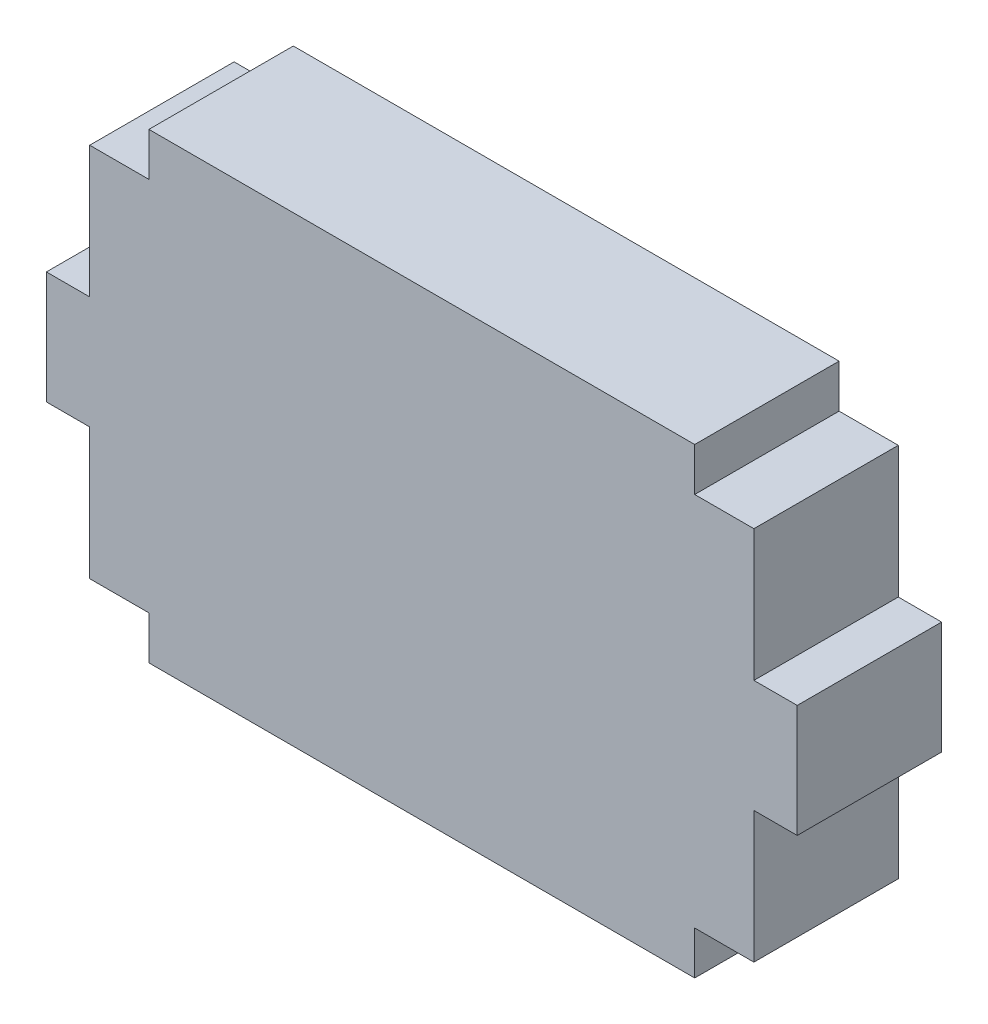
ISO-10303-21;
HEADER;
FILE_DESCRIPTION(('STEP AP214'),'2;1');
FILE_NAME('part.step','',(''),(''),'','','');
FILE_SCHEMA(('AUTOMOTIVE_DESIGN { 1 0 10303 214 1 1 1 1 }'));
ENDSEC;
DATA;
#1=APPLICATION_CONTEXT('core data for automotive mechanical design processes');
#2=APPLICATION_PROTOCOL_DEFINITION('international standard','automotive_design',2000,#1);
#3=PRODUCT_CONTEXT('',#1,'mechanical');
#4=PRODUCT('Part','Part','',(#3));
#5=PRODUCT_RELATED_PRODUCT_CATEGORY('part','',(#4));
#6=PRODUCT_DEFINITION_FORMATION('','',#4);
#7=PRODUCT_DEFINITION_CONTEXT('part definition',#1,'design');
#8=PRODUCT_DEFINITION('design','',#6,#7);
#9=PRODUCT_DEFINITION_SHAPE('','',#8);
#10=(LENGTH_UNIT() NAMED_UNIT(*) SI_UNIT(.MILLI.,.METRE.));
#11=(NAMED_UNIT(*) PLANE_ANGLE_UNIT() SI_UNIT($,.RADIAN.));
#12=(NAMED_UNIT(*) SI_UNIT($,.STERADIAN.) SOLID_ANGLE_UNIT());
#13=UNCERTAINTY_MEASURE_WITH_UNIT(LENGTH_MEASURE(1.E-05),#10,'distance_accuracy_value','');
#14=(GEOMETRIC_REPRESENTATION_CONTEXT(3) GLOBAL_UNCERTAINTY_ASSIGNED_CONTEXT((#13)) GLOBAL_UNIT_ASSIGNED_CONTEXT((#10,
#11,#12)) REPRESENTATION_CONTEXT('',''));
#15=CARTESIAN_POINT('',(0.,0.,0.));
#16=DIRECTION('',(0.,0.,1.));
#17=DIRECTION('',(1.,0.,0.));
#18=AXIS2_PLACEMENT_3D('',#15,#16,#17);
#19=CARTESIAN_POINT('',(0.,0.,1.));
#20=DIRECTION('',(0.,0.,1.));
#21=DIRECTION('',(1.,0.,0.));
#22=AXIS2_PLACEMENT_3D('',#19,#20,#21);
#23=PLANE('',#22);
#24=DIRECTION('',(-1.,0.,0.));
#25=VECTOR('',#24,1.);
#26=CARTESIAN_POINT('',(-1.89,1.3,1.));
#27=LINE('',#26,#25);
#28=CARTESIAN_POINT('',(-1.89,1.3,1.));
#29=VERTEX_POINT('',#28);
#30=CARTESIAN_POINT('',(-2.3,1.3,1.));
#31=VERTEX_POINT('',#30);
#32=EDGE_CURVE('E11',#29,#31,#27,.T.);
#33=ORIENTED_EDGE('',*,*,#32,.T.);
#34=DIRECTION('',(0.,-1.,0.));
#35=VECTOR('',#34,1.);
#36=CARTESIAN_POINT('',(-2.3,1.3,1.));
#37=LINE('',#36,#35);
#38=CARTESIAN_POINT('',(-2.3,0.39,1.));
#39=VERTEX_POINT('',#38);
#40=EDGE_CURVE('E283',#31,#39,#37,.T.);
#41=ORIENTED_EDGE('',*,*,#40,.T.);
#42=DIRECTION('',(-1.,0.,0.));
#43=VECTOR('',#42,1.);
#44=CARTESIAN_POINT('',(-2.3,0.39,1.));
#45=LINE('',#44,#43);
#46=CARTESIAN_POINT('',(-2.6,0.39,1.));
#47=VERTEX_POINT('',#46);
#48=EDGE_CURVE('E90',#39,#47,#45,.T.);
#49=ORIENTED_EDGE('',*,*,#48,.T.);
#50=DIRECTION('',(0.,-1.,0.));
#51=VECTOR('',#50,1.);
#52=CARTESIAN_POINT('',(-2.6,0.39,1.));
#53=LINE('',#52,#51);
#54=CARTESIAN_POINT('',(-2.6,-0.39,1.));
#55=VERTEX_POINT('',#54);
#56=EDGE_CURVE('E100',#47,#55,#53,.T.);
#57=ORIENTED_EDGE('',*,*,#56,.T.);
#58=DIRECTION('',(1.,0.,0.));
#59=VECTOR('',#58,1.);
#60=CARTESIAN_POINT('',(-2.6,-0.39,1.));
#61=LINE('',#60,#59);
#62=CARTESIAN_POINT('',(-2.3,-0.39,1.));
#63=VERTEX_POINT('',#62);
#64=EDGE_CURVE('E265',#55,#63,#61,.T.);
#65=ORIENTED_EDGE('',*,*,#64,.T.);
#66=DIRECTION('',(0.,-1.,0.));
#67=VECTOR('',#66,1.);
#68=CARTESIAN_POINT('',(-2.3,-0.39,1.));
#69=LINE('',#68,#67);
#70=CARTESIAN_POINT('',(-2.3,-1.3,1.));
#71=VERTEX_POINT('',#70);
#72=EDGE_CURVE('E207',#63,#71,#69,.T.);
#73=ORIENTED_EDGE('',*,*,#72,.T.);
#74=DIRECTION('',(1.,0.,0.));
#75=VECTOR('',#74,1.);
#76=CARTESIAN_POINT('',(-2.3,-1.3,1.));
#77=LINE('',#76,#75);
#78=CARTESIAN_POINT('',(-1.89,-1.3,1.));
#79=VERTEX_POINT('',#78);
#80=EDGE_CURVE('E204',#71,#79,#77,.T.);
#81=ORIENTED_EDGE('',*,*,#80,.T.);
#82=DIRECTION('',(0.,-1.,0.));
#83=VECTOR('',#82,1.);
#84=CARTESIAN_POINT('',(-1.89,-1.3,1.));
#85=LINE('',#84,#83);
#86=CARTESIAN_POINT('',(-1.89,-1.6,1.));
#87=VERTEX_POINT('',#86);
#88=EDGE_CURVE('E200',#79,#87,#85,.T.);
#89=ORIENTED_EDGE('',*,*,#88,.T.);
#90=DIRECTION('',(1.,0.,0.));
#91=VECTOR('',#90,1.);
#92=CARTESIAN_POINT('',(-1.89,-1.6,1.));
#93=LINE('',#92,#91);
#94=CARTESIAN_POINT('',(1.89,-1.6,1.));
#95=VERTEX_POINT('',#94);
#96=EDGE_CURVE('E232',#87,#95,#93,.T.);
#97=ORIENTED_EDGE('',*,*,#96,.T.);
#98=DIRECTION('',(0.,1.,0.));
#99=VECTOR('',#98,1.);
#100=CARTESIAN_POINT('',(1.89,-1.6,1.));
#101=LINE('',#100,#99);
#102=CARTESIAN_POINT('',(1.89,-1.3,1.));
#103=VERTEX_POINT('',#102);
#104=EDGE_CURVE('E293',#95,#103,#101,.T.);
#105=ORIENTED_EDGE('',*,*,#104,.T.);
#106=DIRECTION('',(1.,0.,0.));
#107=VECTOR('',#106,1.);
#108=CARTESIAN_POINT('',(1.89,-1.3,1.));
#109=LINE('',#108,#107);
#110=CARTESIAN_POINT('',(2.3,-1.3,1.));
#111=VERTEX_POINT('',#110);
#112=EDGE_CURVE('E273',#103,#111,#109,.T.);
#113=ORIENTED_EDGE('',*,*,#112,.T.);
#114=DIRECTION('',(0.,1.,0.));
#115=VECTOR('',#114,1.);
#116=CARTESIAN_POINT('',(2.3,-1.3,1.));
#117=LINE('',#116,#115);
#118=CARTESIAN_POINT('',(2.3,-0.39,1.));
#119=VERTEX_POINT('',#118);
#120=EDGE_CURVE('E300',#111,#119,#117,.T.);
#121=ORIENTED_EDGE('',*,*,#120,.T.);
#122=DIRECTION('',(1.,0.,0.));
#123=VECTOR('',#122,1.);
#124=CARTESIAN_POINT('',(2.3,-0.39,1.));
#125=LINE('',#124,#123);
#126=CARTESIAN_POINT('',(2.6,-0.39,1.));
#127=VERTEX_POINT('',#126);
#128=EDGE_CURVE('E284',#119,#127,#125,.T.);
#129=ORIENTED_EDGE('',*,*,#128,.T.);
#130=DIRECTION('',(0.,1.,0.));
#131=VECTOR('',#130,1.);
#132=CARTESIAN_POINT('',(2.6,-0.39,1.));
#133=LINE('',#132,#131);
#134=CARTESIAN_POINT('',(2.6,0.39,1.));
#135=VERTEX_POINT('',#134);
#136=EDGE_CURVE('E323',#127,#135,#133,.T.);
#137=ORIENTED_EDGE('',*,*,#136,.T.);
#138=DIRECTION('',(-1.,0.,0.));
#139=VECTOR('',#138,1.);
#140=CARTESIAN_POINT('',(2.6,0.39,1.));
#141=LINE('',#140,#139);
#142=CARTESIAN_POINT('',(2.3,0.39,1.));
#143=VERTEX_POINT('',#142);
#144=EDGE_CURVE('E236',#135,#143,#141,.T.);
#145=ORIENTED_EDGE('',*,*,#144,.T.);
#146=DIRECTION('',(0.,1.,0.));
#147=VECTOR('',#146,1.);
#148=CARTESIAN_POINT('',(2.3,0.39,1.));
#149=LINE('',#148,#147);
#150=CARTESIAN_POINT('',(2.3,1.3,1.));
#151=VERTEX_POINT('',#150);
#152=EDGE_CURVE('E331',#143,#151,#149,.T.);
#153=ORIENTED_EDGE('',*,*,#152,.T.);
#154=DIRECTION('',(-1.,0.,0.));
#155=VECTOR('',#154,1.);
#156=CARTESIAN_POINT('',(2.3,1.3,1.));
#157=LINE('',#156,#155);
#158=CARTESIAN_POINT('',(1.89,1.3,1.));
#159=VERTEX_POINT('',#158);
#160=EDGE_CURVE('E332',#151,#159,#157,.T.);
#161=ORIENTED_EDGE('',*,*,#160,.T.);
#162=DIRECTION('',(0.,1.,0.));
#163=VECTOR('',#162,1.);
#164=CARTESIAN_POINT('',(1.89,1.3,1.));
#165=LINE('',#164,#163);
#166=CARTESIAN_POINT('',(1.89,1.6,1.));
#167=VERTEX_POINT('',#166);
#168=EDGE_CURVE('E336',#159,#167,#165,.T.);
#169=ORIENTED_EDGE('',*,*,#168,.T.);
#170=DIRECTION('',(-1.,0.,0.));
#171=VECTOR('',#170,1.);
#172=CARTESIAN_POINT('',(1.89,1.6,1.));
#173=LINE('',#172,#171);
#174=CARTESIAN_POINT('',(-1.89,1.6,1.));
#175=VERTEX_POINT('',#174);
#176=EDGE_CURVE('E252',#167,#175,#173,.T.);
#177=ORIENTED_EDGE('',*,*,#176,.T.);
#178=DIRECTION('',(0.,-1.,0.));
#179=VECTOR('',#178,1.);
#180=CARTESIAN_POINT('',(-1.89,1.6,1.));
#181=LINE('',#180,#179);
#182=EDGE_CURVE('E246',#175,#29,#181,.T.);
#183=ORIENTED_EDGE('',*,*,#182,.T.);
#184=EDGE_LOOP('',(#33,#41,#49,#57,#65,#73,#81,#89,#97,#105,#113,#121,#129,#137,#145,#153,#161,
#169,#177,#183));
#185=FACE_BOUND('',#184,.T.);
#186=ADVANCED_FACE('F17',(#185),#23,.T.);
#187=CARTESIAN_POINT('',(-1.89,1.3,0.));
#188=DIRECTION('',(0.,1.,0.));
#189=DIRECTION('',(1.,0.,0.));
#190=AXIS2_PLACEMENT_3D('',#187,#188,#189);
#191=PLANE('',#190);
#192=DIRECTION('',(0.,0.,1.));
#193=VECTOR('',#192,1.);
#194=CARTESIAN_POINT('',(-2.3,1.3,0.));
#195=LINE('',#194,#193);
#196=CARTESIAN_POINT('',(-2.3,1.3,0.));
#197=VERTEX_POINT('',#196);
#198=EDGE_CURVE('E28',#197,#31,#195,.T.);
#199=ORIENTED_EDGE('',*,*,#198,.T.);
#200=ORIENTED_EDGE('',*,*,#32,.F.);
#201=DIRECTION('',(0.,0.,1.));
#202=VECTOR('',#201,1.);
#203=CARTESIAN_POINT('',(-1.89,1.3,0.));
#204=LINE('',#203,#202);
#205=CARTESIAN_POINT('',(-1.89,1.3,0.));
#206=VERTEX_POINT('',#205);
#207=EDGE_CURVE('E242',#206,#29,#204,.T.);
#208=ORIENTED_EDGE('',*,*,#207,.F.);
#209=DIRECTION('',(-1.,0.,0.));
#210=VECTOR('',#209,1.);
#211=CARTESIAN_POINT('',(-1.89,1.3,0.));
#212=LINE('',#211,#210);
#213=EDGE_CURVE('E262',#206,#197,#212,.T.);
#214=ORIENTED_EDGE('',*,*,#213,.T.);
#215=EDGE_LOOP('',(#199,#200,#208,#214));
#216=FACE_BOUND('',#215,.T.);
#217=ADVANCED_FACE('F491',(#216),#191,.T.);
#218=CARTESIAN_POINT('',(-2.3,1.3,0.));
#219=DIRECTION('',(-1.,0.,0.));
#220=DIRECTION('',(0.,0.,1.));
#221=AXIS2_PLACEMENT_3D('',#218,#219,#220);
#222=PLANE('',#221);
#223=DIRECTION('',(0.,0.,1.));
#224=VECTOR('',#223,1.);
#225=CARTESIAN_POINT('',(-2.3,0.39,0.));
#226=LINE('',#225,#224);
#227=CARTESIAN_POINT('',(-2.3,0.39,0.));
#228=VERTEX_POINT('',#227);
#229=EDGE_CURVE('E279',#228,#39,#226,.T.);
#230=ORIENTED_EDGE('',*,*,#229,.T.);
#231=ORIENTED_EDGE('',*,*,#40,.F.);
#232=ORIENTED_EDGE('',*,*,#198,.F.);
#233=DIRECTION('',(0.,-1.,0.));
#234=VECTOR('',#233,1.);
#235=CARTESIAN_POINT('',(-2.3,1.3,0.));
#236=LINE('',#235,#234);
#237=EDGE_CURVE('E259',#197,#228,#236,.T.);
#238=ORIENTED_EDGE('',*,*,#237,.T.);
#239=EDGE_LOOP('',(#230,#231,#232,#238));
#240=FACE_BOUND('',#239,.T.);
#241=ADVANCED_FACE('F421',(#240),#222,.T.);
#242=CARTESIAN_POINT('',(-2.3,0.39,0.));
#243=DIRECTION('',(0.,1.,0.));
#244=DIRECTION('',(1.,0.,0.));
#245=AXIS2_PLACEMENT_3D('',#242,#243,#244);
#246=PLANE('',#245);
#247=DIRECTION('',(0.,0.,1.));
#248=VECTOR('',#247,1.);
#249=CARTESIAN_POINT('',(-2.6,0.39,0.));
#250=LINE('',#249,#248);
#251=CARTESIAN_POINT('',(-2.6,0.39,0.));
#252=VERTEX_POINT('',#251);
#253=EDGE_CURVE('E296',#252,#47,#250,.T.);
#254=ORIENTED_EDGE('',*,*,#253,.T.);
#255=ORIENTED_EDGE('',*,*,#48,.F.);
#256=ORIENTED_EDGE('',*,*,#229,.F.);
#257=DIRECTION('',(-1.,0.,0.));
#258=VECTOR('',#257,1.);
#259=CARTESIAN_POINT('',(-2.3,0.39,0.));
#260=LINE('',#259,#258);
#261=EDGE_CURVE('E263',#228,#252,#260,.T.);
#262=ORIENTED_EDGE('',*,*,#261,.T.);
#263=EDGE_LOOP('',(#254,#255,#256,#262));
#264=FACE_BOUND('',#263,.T.);
#265=ADVANCED_FACE('F425',(#264),#246,.T.);
#266=CARTESIAN_POINT('',(-2.6,0.39,0.));
#267=DIRECTION('',(-1.,0.,0.));
#268=DIRECTION('',(0.,0.,1.));
#269=AXIS2_PLACEMENT_3D('',#266,#267,#268);
#270=PLANE('',#269);
#271=DIRECTION('',(0.,0.,1.));
#272=VECTOR('',#271,1.);
#273=CARTESIAN_POINT('',(-2.6,-0.39,0.));
#274=LINE('',#273,#272);
#275=CARTESIAN_POINT('',(-2.6,-0.39,0.));
#276=VERTEX_POINT('',#275);
#277=EDGE_CURVE('E268',#276,#55,#274,.T.);
#278=ORIENTED_EDGE('',*,*,#277,.T.);
#279=ORIENTED_EDGE('',*,*,#56,.F.);
#280=ORIENTED_EDGE('',*,*,#253,.F.);
#281=DIRECTION('',(0.,-1.,0.));
#282=VECTOR('',#281,1.);
#283=CARTESIAN_POINT('',(-2.6,0.39,0.));
#284=LINE('',#283,#282);
#285=EDGE_CURVE('E344',#252,#276,#284,.T.);
#286=ORIENTED_EDGE('',*,*,#285,.T.);
#287=EDGE_LOOP('',(#278,#279,#280,#286));
#288=FACE_BOUND('',#287,.T.);
#289=ADVANCED_FACE('F428',(#288),#270,.T.);
#290=CARTESIAN_POINT('',(-2.6,-0.39,0.));
#291=DIRECTION('',(0.,-1.,0.));
#292=DIRECTION('',(0.,0.,-1.));
#293=AXIS2_PLACEMENT_3D('',#290,#291,#292);
#294=PLANE('',#293);
#295=DIRECTION('',(0.,0.,1.));
#296=VECTOR('',#295,1.);
#297=CARTESIAN_POINT('',(-2.3,-0.39,0.));
#298=LINE('',#297,#296);
#299=CARTESIAN_POINT('',(-2.3,-0.39,0.));
#300=VERTEX_POINT('',#299);
#301=EDGE_CURVE('E269',#300,#63,#298,.T.);
#302=ORIENTED_EDGE('',*,*,#301,.T.);
#303=ORIENTED_EDGE('',*,*,#64,.F.);
#304=ORIENTED_EDGE('',*,*,#277,.F.);
#305=DIRECTION('',(1.,0.,0.));
#306=VECTOR('',#305,1.);
#307=CARTESIAN_POINT('',(-2.6,-0.39,0.));
#308=LINE('',#307,#306);
#309=EDGE_CURVE('E340',#276,#300,#308,.T.);
#310=ORIENTED_EDGE('',*,*,#309,.T.);
#311=EDGE_LOOP('',(#302,#303,#304,#310));
#312=FACE_BOUND('',#311,.T.);
#313=ADVANCED_FACE('F432',(#312),#294,.T.);
#314=CARTESIAN_POINT('',(-2.3,-0.39,0.));
#315=DIRECTION('',(-1.,0.,0.));
#316=DIRECTION('',(0.,0.,1.));
#317=AXIS2_PLACEMENT_3D('',#314,#315,#316);
#318=PLANE('',#317);
#319=DIRECTION('',(0.,0.,1.));
#320=VECTOR('',#319,1.);
#321=CARTESIAN_POINT('',(-2.3,-1.3,0.));
#322=LINE('',#321,#320);
#323=CARTESIAN_POINT('',(-2.3,-1.3,0.));
#324=VERTEX_POINT('',#323);
#325=EDGE_CURVE('E211',#324,#71,#322,.T.);
#326=ORIENTED_EDGE('',*,*,#325,.T.);
#327=ORIENTED_EDGE('',*,*,#72,.F.);
#328=ORIENTED_EDGE('',*,*,#301,.F.);
#329=DIRECTION('',(0.,-1.,0.));
#330=VECTOR('',#329,1.);
#331=CARTESIAN_POINT('',(-2.3,-0.39,0.));
#332=LINE('',#331,#330);
#333=EDGE_CURVE('E303',#300,#324,#332,.T.);
#334=ORIENTED_EDGE('',*,*,#333,.T.);
#335=EDGE_LOOP('',(#326,#327,#328,#334));
#336=FACE_BOUND('',#335,.T.);
#337=ADVANCED_FACE('F435',(#336),#318,.T.);
#338=CARTESIAN_POINT('',(-2.3,-1.3,0.));
#339=DIRECTION('',(0.,-1.,0.));
#340=DIRECTION('',(0.,0.,-1.));
#341=AXIS2_PLACEMENT_3D('',#338,#339,#340);
#342=PLANE('',#341);
#343=DIRECTION('',(0.,0.,1.));
#344=VECTOR('',#343,1.);
#345=CARTESIAN_POINT('',(-1.89,-1.3,0.));
#346=LINE('',#345,#344);
#347=CARTESIAN_POINT('',(-1.89,-1.3,0.));
#348=VERTEX_POINT('',#347);
#349=EDGE_CURVE('E212',#348,#79,#346,.T.);
#350=ORIENTED_EDGE('',*,*,#349,.T.);
#351=ORIENTED_EDGE('',*,*,#80,.F.);
#352=ORIENTED_EDGE('',*,*,#325,.F.);
#353=DIRECTION('',(1.,0.,0.));
#354=VECTOR('',#353,1.);
#355=CARTESIAN_POINT('',(-2.3,-1.3,0.));
#356=LINE('',#355,#354);
#357=EDGE_CURVE('E217',#324,#348,#356,.T.);
#358=ORIENTED_EDGE('',*,*,#357,.T.);
#359=EDGE_LOOP('',(#350,#351,#352,#358));
#360=FACE_BOUND('',#359,.T.);
#361=ADVANCED_FACE('F215',(#360),#342,.T.);
#362=CARTESIAN_POINT('',(-1.89,-1.3,0.));
#363=DIRECTION('',(-1.,0.,0.));
#364=DIRECTION('',(0.,0.,1.));
#365=AXIS2_PLACEMENT_3D('',#362,#363,#364);
#366=PLANE('',#365);
#367=DIRECTION('',(0.,0.,1.));
#368=VECTOR('',#367,1.);
#369=CARTESIAN_POINT('',(-1.89,-1.6,0.));
#370=LINE('',#369,#368);
#371=CARTESIAN_POINT('',(-1.89,-1.6,0.));
#372=VERTEX_POINT('',#371);
#373=EDGE_CURVE('E224',#372,#87,#370,.T.);
#374=ORIENTED_EDGE('',*,*,#373,.T.);
#375=ORIENTED_EDGE('',*,*,#88,.F.);
#376=ORIENTED_EDGE('',*,*,#349,.F.);
#377=DIRECTION('',(0.,-1.,0.));
#378=VECTOR('',#377,1.);
#379=CARTESIAN_POINT('',(-1.89,-1.3,0.));
#380=LINE('',#379,#378);
#381=EDGE_CURVE('E304',#348,#372,#380,.T.);
#382=ORIENTED_EDGE('',*,*,#381,.T.);
#383=EDGE_LOOP('',(#374,#375,#376,#382));
#384=FACE_BOUND('',#383,.T.);
#385=ADVANCED_FACE('F223',(#384),#366,.T.);
#386=CARTESIAN_POINT('',(-1.89,-1.6,0.));
#387=DIRECTION('',(0.,-1.,0.));
#388=DIRECTION('',(0.,0.,-1.));
#389=AXIS2_PLACEMENT_3D('',#386,#387,#388);
#390=PLANE('',#389);
#391=DIRECTION('',(0.,0.,1.));
#392=VECTOR('',#391,1.);
#393=CARTESIAN_POINT('',(1.89,-1.6,0.));
#394=LINE('',#393,#392);
#395=CARTESIAN_POINT('',(1.89,-1.6,0.));
#396=VERTEX_POINT('',#395);
#397=EDGE_CURVE('E289',#396,#95,#394,.T.);
#398=ORIENTED_EDGE('',*,*,#397,.T.);
#399=ORIENTED_EDGE('',*,*,#96,.F.);
#400=ORIENTED_EDGE('',*,*,#373,.F.);
#401=DIRECTION('',(1.,0.,0.));
#402=VECTOR('',#401,1.);
#403=CARTESIAN_POINT('',(-1.89,-1.6,0.));
#404=LINE('',#403,#402);
#405=EDGE_CURVE('E240',#372,#396,#404,.T.);
#406=ORIENTED_EDGE('',*,*,#405,.T.);
#407=EDGE_LOOP('',(#398,#399,#400,#406));
#408=FACE_BOUND('',#407,.T.);
#409=ADVANCED_FACE('F443',(#408),#390,.T.);
#410=CARTESIAN_POINT('',(1.89,-1.6,0.));
#411=DIRECTION('',(1.,0.,0.));
#412=DIRECTION('',(0.,1.,0.));
#413=AXIS2_PLACEMENT_3D('',#410,#411,#412);
#414=PLANE('',#413);
#415=DIRECTION('',(0.,0.,1.));
#416=VECTOR('',#415,1.);
#417=CARTESIAN_POINT('',(1.89,-1.3,0.));
#418=LINE('',#417,#416);
#419=CARTESIAN_POINT('',(1.89,-1.3,0.));
#420=VERTEX_POINT('',#419);
#421=EDGE_CURVE('E21',#420,#103,#418,.T.);
#422=ORIENTED_EDGE('',*,*,#421,.T.);
#423=ORIENTED_EDGE('',*,*,#104,.F.);
#424=ORIENTED_EDGE('',*,*,#397,.F.);
#425=DIRECTION('',(0.,1.,0.));
#426=VECTOR('',#425,1.);
#427=CARTESIAN_POINT('',(1.89,-1.6,0.));
#428=LINE('',#427,#426);
#429=EDGE_CURVE('E237',#396,#420,#428,.T.);
#430=ORIENTED_EDGE('',*,*,#429,.T.);
#431=EDGE_LOOP('',(#422,#423,#424,#430));
#432=FACE_BOUND('',#431,.T.);
#433=ADVANCED_FACE('F448',(#432),#414,.T.);
#434=CARTESIAN_POINT('',(1.89,-1.3,0.));
#435=DIRECTION('',(0.,-1.,0.));
#436=DIRECTION('',(0.,0.,-1.));
#437=AXIS2_PLACEMENT_3D('',#434,#435,#436);
#438=PLANE('',#437);
#439=DIRECTION('',(0.,0.,1.));
#440=VECTOR('',#439,1.);
#441=CARTESIAN_POINT('',(2.3,-1.3,0.));
#442=LINE('',#441,#440);
#443=CARTESIAN_POINT('',(2.3,-1.3,0.));
#444=VERTEX_POINT('',#443);
#445=EDGE_CURVE('E275',#444,#111,#442,.T.);
#446=ORIENTED_EDGE('',*,*,#445,.T.);
#447=ORIENTED_EDGE('',*,*,#112,.F.);
#448=ORIENTED_EDGE('',*,*,#421,.F.);
#449=DIRECTION('',(1.,0.,0.));
#450=VECTOR('',#449,1.);
#451=CARTESIAN_POINT('',(1.89,-1.3,0.));
#452=LINE('',#451,#450);
#453=EDGE_CURVE('E241',#420,#444,#452,.T.);
#454=ORIENTED_EDGE('',*,*,#453,.T.);
#455=EDGE_LOOP('',(#446,#447,#448,#454));
#456=FACE_BOUND('',#455,.T.);
#457=ADVANCED_FACE('F450',(#456),#438,.T.);
#458=CARTESIAN_POINT('',(2.3,-1.3,0.));
#459=DIRECTION('',(1.,0.,0.));
#460=DIRECTION('',(0.,1.,0.));
#461=AXIS2_PLACEMENT_3D('',#458,#459,#460);
#462=PLANE('',#461);
#463=DIRECTION('',(0.,0.,1.));
#464=VECTOR('',#463,1.);
#465=CARTESIAN_POINT('',(2.3,-0.39,0.));
#466=LINE('',#465,#464);
#467=CARTESIAN_POINT('',(2.3,-0.39,0.));
#468=VERTEX_POINT('',#467);
#469=EDGE_CURVE('E287',#468,#119,#466,.T.);
#470=ORIENTED_EDGE('',*,*,#469,.T.);
#471=ORIENTED_EDGE('',*,*,#120,.F.);
#472=ORIENTED_EDGE('',*,*,#445,.F.);
#473=DIRECTION('',(0.,1.,0.));
#474=VECTOR('',#473,1.);
#475=CARTESIAN_POINT('',(2.3,-1.3,0.));
#476=LINE('',#475,#474);
#477=EDGE_CURVE('E318',#444,#468,#476,.T.);
#478=ORIENTED_EDGE('',*,*,#477,.T.);
#479=EDGE_LOOP('',(#470,#471,#472,#478));
#480=FACE_BOUND('',#479,.T.);
#481=ADVANCED_FACE('F454',(#480),#462,.T.);
#482=CARTESIAN_POINT('',(2.3,-0.39,0.));
#483=DIRECTION('',(0.,-1.,0.));
#484=DIRECTION('',(0.,0.,-1.));
#485=AXIS2_PLACEMENT_3D('',#482,#483,#484);
#486=PLANE('',#485);
#487=DIRECTION('',(0.,0.,1.));
#488=VECTOR('',#487,1.);
#489=CARTESIAN_POINT('',(2.6,-0.39,0.));
#490=LINE('',#489,#488);
#491=CARTESIAN_POINT('',(2.6,-0.39,0.));
#492=VERTEX_POINT('',#491);
#493=EDGE_CURVE('E288',#492,#127,#490,.T.);
#494=ORIENTED_EDGE('',*,*,#493,.T.);
#495=ORIENTED_EDGE('',*,*,#128,.F.);
#496=ORIENTED_EDGE('',*,*,#469,.F.);
#497=DIRECTION('',(1.,0.,0.));
#498=VECTOR('',#497,1.);
#499=CARTESIAN_POINT('',(2.3,-0.39,0.));
#500=LINE('',#499,#498);
#501=EDGE_CURVE('E322',#468,#492,#500,.T.);
#502=ORIENTED_EDGE('',*,*,#501,.T.);
#503=EDGE_LOOP('',(#494,#495,#496,#502));
#504=FACE_BOUND('',#503,.T.);
#505=ADVANCED_FACE('F458',(#504),#486,.T.);
#506=CARTESIAN_POINT('',(2.6,-0.39,0.));
#507=DIRECTION('',(1.,0.,0.));
#508=DIRECTION('',(0.,1.,0.));
#509=AXIS2_PLACEMENT_3D('',#506,#507,#508);
#510=PLANE('',#509);
#511=DIRECTION('',(0.,0.,1.));
#512=VECTOR('',#511,1.);
#513=CARTESIAN_POINT('',(2.6,0.39,0.));
#514=LINE('',#513,#512);
#515=CARTESIAN_POINT('',(2.6,0.39,0.));
#516=VERTEX_POINT('',#515);
#517=EDGE_CURVE('E326',#516,#135,#514,.T.);
#518=ORIENTED_EDGE('',*,*,#517,.T.);
#519=ORIENTED_EDGE('',*,*,#136,.F.);
#520=ORIENTED_EDGE('',*,*,#493,.F.);
#521=DIRECTION('',(0.,1.,0.));
#522=VECTOR('',#521,1.);
#523=CARTESIAN_POINT('',(2.6,-0.39,0.));
#524=LINE('',#523,#522);
#525=EDGE_CURVE('E356',#492,#516,#524,.T.);
#526=ORIENTED_EDGE('',*,*,#525,.T.);
#527=EDGE_LOOP('',(#518,#519,#520,#526));
#528=FACE_BOUND('',#527,.T.);
#529=ADVANCED_FACE('F462',(#528),#510,.T.);
#530=CARTESIAN_POINT('',(2.6,0.39,0.));
#531=DIRECTION('',(0.,1.,0.));
#532=DIRECTION('',(1.,0.,0.));
#533=AXIS2_PLACEMENT_3D('',#530,#531,#532);
#534=PLANE('',#533);
#535=DIRECTION('',(0.,0.,1.));
#536=VECTOR('',#535,1.);
#537=CARTESIAN_POINT('',(2.3,0.39,0.));
#538=LINE('',#537,#536);
#539=CARTESIAN_POINT('',(2.3,0.39,0.));
#540=VERTEX_POINT('',#539);
#541=EDGE_CURVE('E339',#540,#143,#538,.T.);
#542=ORIENTED_EDGE('',*,*,#541,.T.);
#543=ORIENTED_EDGE('',*,*,#144,.F.);
#544=ORIENTED_EDGE('',*,*,#517,.F.);
#545=DIRECTION('',(-1.,0.,0.));
#546=VECTOR('',#545,1.);
#547=CARTESIAN_POINT('',(2.6,0.39,0.));
#548=LINE('',#547,#546);
#549=EDGE_CURVE('E367',#516,#540,#548,.T.);
#550=ORIENTED_EDGE('',*,*,#549,.T.);
#551=EDGE_LOOP('',(#542,#543,#544,#550));
#552=FACE_BOUND('',#551,.T.);
#553=ADVANCED_FACE('F466',(#552),#534,.T.);
#554=CARTESIAN_POINT('',(2.3,0.39,0.));
#555=DIRECTION('',(1.,0.,0.));
#556=DIRECTION('',(0.,1.,0.));
#557=AXIS2_PLACEMENT_3D('',#554,#555,#556);
#558=PLANE('',#557);
#559=DIRECTION('',(0.,0.,1.));
#560=VECTOR('',#559,1.);
#561=CARTESIAN_POINT('',(2.3,1.3,0.));
#562=LINE('',#561,#560);
#563=CARTESIAN_POINT('',(2.3,1.3,0.));
#564=VERTEX_POINT('',#563);
#565=EDGE_CURVE('E327',#564,#151,#562,.T.);
#566=ORIENTED_EDGE('',*,*,#565,.T.);
#567=ORIENTED_EDGE('',*,*,#152,.F.);
#568=ORIENTED_EDGE('',*,*,#541,.F.);
#569=DIRECTION('',(0.,1.,0.));
#570=VECTOR('',#569,1.);
#571=CARTESIAN_POINT('',(2.3,0.39,0.));
#572=LINE('',#571,#570);
#573=EDGE_CURVE('E310',#540,#564,#572,.T.);
#574=ORIENTED_EDGE('',*,*,#573,.T.);
#575=EDGE_LOOP('',(#566,#567,#568,#574));
#576=FACE_BOUND('',#575,.T.);
#577=ADVANCED_FACE('F473',(#576),#558,.T.);
#578=CARTESIAN_POINT('',(2.3,1.3,0.));
#579=DIRECTION('',(0.,1.,0.));
#580=DIRECTION('',(1.,0.,0.));
#581=AXIS2_PLACEMENT_3D('',#578,#579,#580);
#582=PLANE('',#581);
#583=DIRECTION('',(0.,0.,1.));
#584=VECTOR('',#583,1.);
#585=CARTESIAN_POINT('',(1.89,1.3,0.));
#586=LINE('',#585,#584);
#587=CARTESIAN_POINT('',(1.89,1.3,0.));
#588=VERTEX_POINT('',#587);
#589=EDGE_CURVE('E357',#588,#159,#586,.T.);
#590=ORIENTED_EDGE('',*,*,#589,.T.);
#591=ORIENTED_EDGE('',*,*,#160,.F.);
#592=ORIENTED_EDGE('',*,*,#565,.F.);
#593=DIRECTION('',(-1.,0.,0.));
#594=VECTOR('',#593,1.);
#595=CARTESIAN_POINT('',(2.3,1.3,0.));
#596=LINE('',#595,#594);
#597=EDGE_CURVE('E257',#564,#588,#596,.T.);
#598=ORIENTED_EDGE('',*,*,#597,.T.);
#599=EDGE_LOOP('',(#590,#591,#592,#598));
#600=FACE_BOUND('',#599,.T.);
#601=ADVANCED_FACE('F477',(#600),#582,.T.);
#602=CARTESIAN_POINT('',(1.89,1.3,0.));
#603=DIRECTION('',(1.,0.,0.));
#604=DIRECTION('',(0.,1.,0.));
#605=AXIS2_PLACEMENT_3D('',#602,#603,#604);
#606=PLANE('',#605);
#607=DIRECTION('',(0.,0.,1.));
#608=VECTOR('',#607,1.);
#609=CARTESIAN_POINT('',(1.89,1.6,0.));
#610=LINE('',#609,#608);
#611=CARTESIAN_POINT('',(1.89,1.6,0.));
#612=VERTEX_POINT('',#611);
#613=EDGE_CURVE('E272',#612,#167,#610,.T.);
#614=ORIENTED_EDGE('',*,*,#613,.T.);
#615=ORIENTED_EDGE('',*,*,#168,.F.);
#616=ORIENTED_EDGE('',*,*,#589,.F.);
#617=DIRECTION('',(0.,1.,0.));
#618=VECTOR('',#617,1.);
#619=CARTESIAN_POINT('',(1.89,1.3,0.));
#620=LINE('',#619,#618);
#621=EDGE_CURVE('E253',#588,#612,#620,.T.);
#622=ORIENTED_EDGE('',*,*,#621,.T.);
#623=EDGE_LOOP('',(#614,#615,#616,#622));
#624=FACE_BOUND('',#623,.T.);
#625=ADVANCED_FACE('F481',(#624),#606,.T.);
#626=CARTESIAN_POINT('',(1.89,1.6,0.));
#627=DIRECTION('',(0.,1.,0.));
#628=DIRECTION('',(1.,0.,0.));
#629=AXIS2_PLACEMENT_3D('',#626,#627,#628);
#630=PLANE('',#629);
#631=DIRECTION('',(0.,0.,1.));
#632=VECTOR('',#631,1.);
#633=CARTESIAN_POINT('',(-1.89,1.6,0.));
#634=LINE('',#633,#632);
#635=CARTESIAN_POINT('',(-1.89,1.6,0.));
#636=VERTEX_POINT('',#635);
#637=EDGE_CURVE('E248',#636,#175,#634,.T.);
#638=ORIENTED_EDGE('',*,*,#637,.T.);
#639=ORIENTED_EDGE('',*,*,#176,.F.);
#640=ORIENTED_EDGE('',*,*,#613,.F.);
#641=DIRECTION('',(-1.,0.,0.));
#642=VECTOR('',#641,1.);
#643=CARTESIAN_POINT('',(1.89,1.6,0.));
#644=LINE('',#643,#642);
#645=EDGE_CURVE('E258',#612,#636,#644,.T.);
#646=ORIENTED_EDGE('',*,*,#645,.T.);
#647=EDGE_LOOP('',(#638,#639,#640,#646));
#648=FACE_BOUND('',#647,.T.);
#649=ADVANCED_FACE('F19',(#648),#630,.T.);
#650=CARTESIAN_POINT('',(-1.89,1.6,0.));
#651=DIRECTION('',(-1.,0.,0.));
#652=DIRECTION('',(0.,0.,1.));
#653=AXIS2_PLACEMENT_3D('',#650,#651,#652);
#654=PLANE('',#653);
#655=ORIENTED_EDGE('',*,*,#207,.T.);
#656=ORIENTED_EDGE('',*,*,#182,.F.);
#657=ORIENTED_EDGE('',*,*,#637,.F.);
#658=DIRECTION('',(0.,-1.,0.));
#659=VECTOR('',#658,1.);
#660=CARTESIAN_POINT('',(-1.89,1.6,0.));
#661=LINE('',#660,#659);
#662=EDGE_CURVE('E247',#636,#206,#661,.T.);
#663=ORIENTED_EDGE('',*,*,#662,.T.);
#664=EDGE_LOOP('',(#655,#656,#657,#663));
#665=FACE_BOUND('',#664,.T.);
#666=ADVANCED_FACE('F488',(#665),#654,.T.);
#667=CARTESIAN_POINT('',(0.,0.,0.));
#668=DIRECTION('',(0.,0.,1.));
#669=DIRECTION('',(1.,0.,0.));
#670=AXIS2_PLACEMENT_3D('',#667,#668,#669);
#671=PLANE('',#670);
#672=ORIENTED_EDGE('',*,*,#645,.F.);
#673=ORIENTED_EDGE('',*,*,#621,.F.);
#674=ORIENTED_EDGE('',*,*,#597,.F.);
#675=ORIENTED_EDGE('',*,*,#573,.F.);
#676=ORIENTED_EDGE('',*,*,#549,.F.);
#677=ORIENTED_EDGE('',*,*,#525,.F.);
#678=ORIENTED_EDGE('',*,*,#501,.F.);
#679=ORIENTED_EDGE('',*,*,#477,.F.);
#680=ORIENTED_EDGE('',*,*,#453,.F.);
#681=ORIENTED_EDGE('',*,*,#429,.F.);
#682=ORIENTED_EDGE('',*,*,#405,.F.);
#683=ORIENTED_EDGE('',*,*,#381,.F.);
#684=ORIENTED_EDGE('',*,*,#357,.F.);
#685=ORIENTED_EDGE('',*,*,#333,.F.);
#686=ORIENTED_EDGE('',*,*,#309,.F.);
#687=ORIENTED_EDGE('',*,*,#285,.F.);
#688=ORIENTED_EDGE('',*,*,#261,.F.);
#689=ORIENTED_EDGE('',*,*,#237,.F.);
#690=ORIENTED_EDGE('',*,*,#213,.F.);
#691=ORIENTED_EDGE('',*,*,#662,.F.);
#692=EDGE_LOOP('',(#672,#673,#674,#675,#676,#677,#678,#679,#680,#681,#682,#683,#684,#685,#686,
#687,#688,#689,#690,#691));
#693=FACE_BOUND('',#692,.T.);
#694=ADVANCED_FACE('F438',(#693),#671,.F.);
#695=CLOSED_SHELL('',(#186,#217,#241,#265,#289,#313,#337,#361,#385,#409,#433,#457,#481,#505,
#529,#553,#577,#601,#625,#649,#666,#694));
#696=MANIFOLD_SOLID_BREP('B1',#695);
#697=ADVANCED_BREP_SHAPE_REPRESENTATION('',(#18,#696),#14);
#698=SHAPE_DEFINITION_REPRESENTATION(#9,#697);
ENDSEC;
END-ISO-10303-21;
